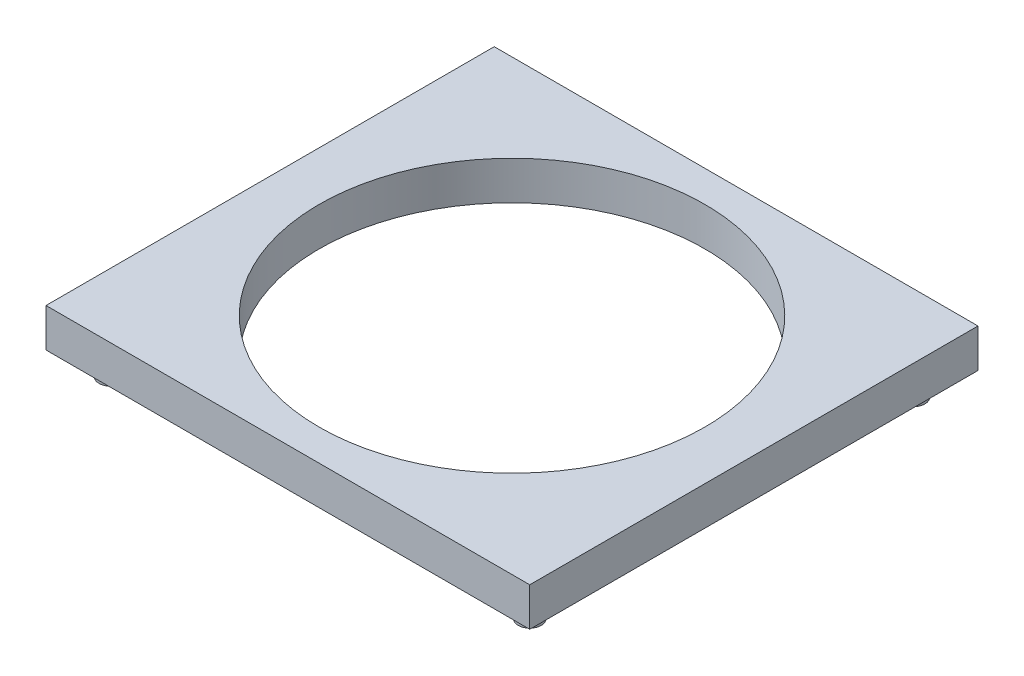
ISO-10303-21;
HEADER;
FILE_DESCRIPTION(('STEP AP214'),'2;1');
FILE_NAME('part.step','',(''),(''),'','','');
FILE_SCHEMA(('AUTOMOTIVE_DESIGN { 1 0 10303 214 1 1 1 1 }'));
ENDSEC;
DATA;
#1=APPLICATION_CONTEXT('core data for automotive mechanical design processes');
#2=APPLICATION_PROTOCOL_DEFINITION('international standard','automotive_design',2000,#1);
#3=PRODUCT_CONTEXT('',#1,'mechanical');
#4=PRODUCT('Part','Part','',(#3));
#5=PRODUCT_RELATED_PRODUCT_CATEGORY('part','',(#4));
#6=PRODUCT_DEFINITION_FORMATION('','',#4);
#7=PRODUCT_DEFINITION_CONTEXT('part definition',#1,'design');
#8=PRODUCT_DEFINITION('design','',#6,#7);
#9=PRODUCT_DEFINITION_SHAPE('','',#8);
#10=(LENGTH_UNIT() NAMED_UNIT(*) SI_UNIT(.MILLI.,.METRE.));
#11=(NAMED_UNIT(*) PLANE_ANGLE_UNIT() SI_UNIT($,.RADIAN.));
#12=(NAMED_UNIT(*) SI_UNIT($,.STERADIAN.) SOLID_ANGLE_UNIT());
#13=UNCERTAINTY_MEASURE_WITH_UNIT(LENGTH_MEASURE(1.E-05),#10,'distance_accuracy_value','');
#14=(GEOMETRIC_REPRESENTATION_CONTEXT(3) GLOBAL_UNCERTAINTY_ASSIGNED_CONTEXT((#13)) GLOBAL_UNIT_ASSIGNED_CONTEXT((#10,
#11,#12)) REPRESENTATION_CONTEXT('',''));
#15=CARTESIAN_POINT('',(0.,0.,0.));
#16=DIRECTION('',(0.,0.,1.));
#17=DIRECTION('',(1.,0.,0.));
#18=AXIS2_PLACEMENT_3D('',#15,#16,#17);
#19=CARTESIAN_POINT('',(0.,5.,0.));
#20=DIRECTION('',(0.,-1.,0.));
#21=DIRECTION('',(0.,0.,-1.));
#22=AXIS2_PLACEMENT_3D('',#19,#20,#21);
#23=PLANE('',#22);
#24=DIRECTION('',(0.,0.,-1.));
#25=VECTOR('',#24,1.);
#26=CARTESIAN_POINT('',(31.35,5.,29.05));
#27=LINE('',#26,#25);
#28=CARTESIAN_POINT('',(31.35,5.,29.05));
#29=VERTEX_POINT('',#28);
#30=CARTESIAN_POINT('',(31.35,5.,-29.05));
#31=VERTEX_POINT('',#30);
#32=EDGE_CURVE('E94',#29,#31,#27,.T.);
#33=ORIENTED_EDGE('',*,*,#32,.T.);
#34=DIRECTION('',(-1.,0.,0.));
#35=VECTOR('',#34,1.);
#36=CARTESIAN_POINT('',(-31.35,5.,-29.05));
#37=LINE('',#36,#35);
#38=CARTESIAN_POINT('',(-31.35,5.,-29.05));
#39=VERTEX_POINT('',#38);
#40=EDGE_CURVE('E89',#31,#39,#37,.T.);
#41=ORIENTED_EDGE('',*,*,#40,.T.);
#42=DIRECTION('',(0.,0.,1.));
#43=VECTOR('',#42,1.);
#44=CARTESIAN_POINT('',(-31.35,5.,29.05));
#45=LINE('',#44,#43);
#46=CARTESIAN_POINT('',(-31.35,5.,29.05));
#47=VERTEX_POINT('',#46);
#48=EDGE_CURVE('E92',#39,#47,#45,.T.);
#49=ORIENTED_EDGE('',*,*,#48,.T.);
#50=DIRECTION('',(1.,0.,0.));
#51=VECTOR('',#50,1.);
#52=CARTESIAN_POINT('',(-31.35,5.,29.05));
#53=LINE('',#52,#51);
#54=EDGE_CURVE('E59',#47,#29,#53,.T.);
#55=ORIENTED_EDGE('',*,*,#54,.T.);
#56=EDGE_LOOP('',(#33,#41,#49,#55));
#57=FACE_BOUND('',#56,.T.);
#58=CARTESIAN_POINT('',(0.,5.,0.));
#59=DIRECTION('',(0.,1.,0.));
#60=DIRECTION('',(0.,0.,1.));
#61=AXIS2_PLACEMENT_3D('',#58,#59,#60);
#62=CIRCLE('',#61,25.);
#63=CARTESIAN_POINT('',(0.,5.,25.));
#64=VERTEX_POINT('',#63);
#65=EDGE_CURVE('E109',#64,#64,#62,.T.);
#66=ORIENTED_EDGE('',*,*,#65,.F.);
#67=EDGE_LOOP('',(#66));
#68=FACE_BOUND('',#67,.T.);
#69=ADVANCED_FACE('F42',(#57,#68),#23,.F.);
#70=CARTESIAN_POINT('',(0.,0.,0.));
#71=DIRECTION('',(0.,-1.,0.));
#72=DIRECTION('',(0.,0.,-1.));
#73=AXIS2_PLACEMENT_3D('',#70,#71,#72);
#74=PLANE('',#73);
#75=CARTESIAN_POINT('',(-27.1634079738271,0.,-24.8634079738271));
#76=DIRECTION('',(0.,-1.,0.));
#77=DIRECTION('',(0.,0.,1.));
#78=AXIS2_PLACEMENT_3D('',#75,#76,#77);
#79=CIRCLE('',#78,1.5);
#80=CARTESIAN_POINT('',(-27.1634079738271,0.,-23.3634079738271));
#81=VERTEX_POINT('',#80);
#82=EDGE_CURVE('E142',#81,#81,#79,.T.);
#83=ORIENTED_EDGE('',*,*,#82,.F.);
#84=EDGE_LOOP('',(#83));
#85=FACE_BOUND('',#84,.T.);
#86=CARTESIAN_POINT('',(27.1634079738271,0.,-24.8634079738271));
#87=DIRECTION('',(0.,-1.,0.));
#88=DIRECTION('',(0.,0.,-1.));
#89=AXIS2_PLACEMENT_3D('',#86,#87,#88);
#90=CIRCLE('',#89,1.5);
#91=CARTESIAN_POINT('',(27.1634079738271,0.,-26.3634079738271));
#92=VERTEX_POINT('',#91);
#93=EDGE_CURVE('E136',#92,#92,#90,.T.);
#94=ORIENTED_EDGE('',*,*,#93,.F.);
#95=EDGE_LOOP('',(#94));
#96=FACE_BOUND('',#95,.T.);
#97=CARTESIAN_POINT('',(27.1634079738271,0.,24.8634079738271));
#98=DIRECTION('',(0.,-1.,0.));
#99=DIRECTION('',(0.,0.,1.));
#100=AXIS2_PLACEMENT_3D('',#97,#98,#99);
#101=CIRCLE('',#100,1.5);
#102=CARTESIAN_POINT('',(27.1634079738271,0.,26.3634079738271));
#103=VERTEX_POINT('',#102);
#104=EDGE_CURVE('E130',#103,#103,#101,.T.);
#105=ORIENTED_EDGE('',*,*,#104,.F.);
#106=EDGE_LOOP('',(#105));
#107=FACE_BOUND('',#106,.T.);
#108=CARTESIAN_POINT('',(-27.1634079738271,0.,24.8634079738271));
#109=DIRECTION('',(0.,-1.,0.));
#110=DIRECTION('',(0.,0.,-1.));
#111=AXIS2_PLACEMENT_3D('',#108,#109,#110);
#112=CIRCLE('',#111,1.5);
#113=CARTESIAN_POINT('',(-27.1634079738271,0.,23.3634079738271));
#114=VERTEX_POINT('',#113);
#115=EDGE_CURVE('E127',#114,#114,#112,.T.);
#116=ORIENTED_EDGE('',*,*,#115,.F.);
#117=EDGE_LOOP('',(#116));
#118=FACE_BOUND('',#117,.T.);
#119=DIRECTION('',(0.,0.,-1.));
#120=VECTOR('',#119,1.);
#121=CARTESIAN_POINT('',(31.35,0.,29.05));
#122=LINE('',#121,#120);
#123=CARTESIAN_POINT('',(31.35,0.,29.05));
#124=VERTEX_POINT('',#123);
#125=CARTESIAN_POINT('',(31.35,0.,-29.05));
#126=VERTEX_POINT('',#125);
#127=EDGE_CURVE('E106',#124,#126,#122,.T.);
#128=ORIENTED_EDGE('',*,*,#127,.F.);
#129=DIRECTION('',(1.,0.,0.));
#130=VECTOR('',#129,1.);
#131=CARTESIAN_POINT('',(-31.35,0.,29.05));
#132=LINE('',#131,#130);
#133=CARTESIAN_POINT('',(-31.35,0.,29.05));
#134=VERTEX_POINT('',#133);
#135=EDGE_CURVE('E82',#134,#124,#132,.T.);
#136=ORIENTED_EDGE('',*,*,#135,.F.);
#137=DIRECTION('',(0.,0.,1.));
#138=VECTOR('',#137,1.);
#139=CARTESIAN_POINT('',(-31.35,0.,29.05));
#140=LINE('',#139,#138);
#141=CARTESIAN_POINT('',(-31.35,0.,-29.05));
#142=VERTEX_POINT('',#141);
#143=EDGE_CURVE('E76',#142,#134,#140,.T.);
#144=ORIENTED_EDGE('',*,*,#143,.F.);
#145=DIRECTION('',(-1.,0.,0.));
#146=VECTOR('',#145,1.);
#147=CARTESIAN_POINT('',(-31.35,0.,-29.05));
#148=LINE('',#147,#146);
#149=EDGE_CURVE('E98',#126,#142,#148,.T.);
#150=ORIENTED_EDGE('',*,*,#149,.F.);
#151=EDGE_LOOP('',(#128,#136,#144,#150));
#152=FACE_BOUND('',#151,.T.);
#153=CARTESIAN_POINT('',(0.,0.,0.));
#154=DIRECTION('',(0.,1.,0.));
#155=DIRECTION('',(0.,0.,1.));
#156=AXIS2_PLACEMENT_3D('',#153,#154,#155);
#157=CIRCLE('',#156,25.);
#158=CARTESIAN_POINT('',(0.,0.,25.));
#159=VERTEX_POINT('',#158);
#160=EDGE_CURVE('E121',#159,#159,#157,.T.);
#161=ORIENTED_EDGE('',*,*,#160,.T.);
#162=EDGE_LOOP('',(#161));
#163=FACE_BOUND('',#162,.T.);
#164=ADVANCED_FACE('F117',(#85,#96,#107,#118,#152,#163),#74,.T.);
#165=CARTESIAN_POINT('',(31.35,5.,29.05));
#166=DIRECTION('',(-1.,0.,0.));
#167=DIRECTION('',(0.,0.,1.));
#168=AXIS2_PLACEMENT_3D('',#165,#166,#167);
#169=PLANE('',#168);
#170=ORIENTED_EDGE('',*,*,#127,.T.);
#171=DIRECTION('',(0.,-1.,0.));
#172=VECTOR('',#171,1.);
#173=CARTESIAN_POINT('',(31.35,5.,-29.05));
#174=LINE('',#173,#172);
#175=EDGE_CURVE('E11',#31,#126,#174,.T.);
#176=ORIENTED_EDGE('',*,*,#175,.F.);
#177=ORIENTED_EDGE('',*,*,#32,.F.);
#178=DIRECTION('',(0.,-1.,0.));
#179=VECTOR('',#178,1.);
#180=CARTESIAN_POINT('',(31.35,5.,29.05));
#181=LINE('',#180,#179);
#182=EDGE_CURVE('E102',#29,#124,#181,.T.);
#183=ORIENTED_EDGE('',*,*,#182,.T.);
#184=EDGE_LOOP('',(#170,#176,#177,#183));
#185=FACE_BOUND('',#184,.T.);
#186=ADVANCED_FACE('F44',(#185),#169,.F.);
#187=CARTESIAN_POINT('',(-31.35,5.,-29.05));
#188=DIRECTION('',(0.,0.,1.));
#189=DIRECTION('',(1.,0.,0.));
#190=AXIS2_PLACEMENT_3D('',#187,#188,#189);
#191=PLANE('',#190);
#192=ORIENTED_EDGE('',*,*,#149,.T.);
#193=DIRECTION('',(0.,-1.,0.));
#194=VECTOR('',#193,1.);
#195=CARTESIAN_POINT('',(-31.35,5.,-29.05));
#196=LINE('',#195,#194);
#197=EDGE_CURVE('E51',#39,#142,#196,.T.);
#198=ORIENTED_EDGE('',*,*,#197,.F.);
#199=ORIENTED_EDGE('',*,*,#40,.F.);
#200=ORIENTED_EDGE('',*,*,#175,.T.);
#201=EDGE_LOOP('',(#192,#198,#199,#200));
#202=FACE_BOUND('',#201,.T.);
#203=ADVANCED_FACE('F97',(#202),#191,.F.);
#204=CARTESIAN_POINT('',(-31.35,5.,29.05));
#205=DIRECTION('',(1.,0.,0.));
#206=DIRECTION('',(0.,0.,-1.));
#207=AXIS2_PLACEMENT_3D('',#204,#205,#206);
#208=PLANE('',#207);
#209=ORIENTED_EDGE('',*,*,#143,.T.);
#210=DIRECTION('',(0.,-1.,0.));
#211=VECTOR('',#210,1.);
#212=CARTESIAN_POINT('',(-31.35,5.,29.05));
#213=LINE('',#212,#211);
#214=EDGE_CURVE('E99',#47,#134,#213,.T.);
#215=ORIENTED_EDGE('',*,*,#214,.F.);
#216=ORIENTED_EDGE('',*,*,#48,.F.);
#217=ORIENTED_EDGE('',*,*,#197,.T.);
#218=EDGE_LOOP('',(#209,#215,#216,#217));
#219=FACE_BOUND('',#218,.T.);
#220=ADVANCED_FACE('F100',(#219),#208,.F.);
#221=CARTESIAN_POINT('',(-31.35,5.,29.05));
#222=DIRECTION('',(0.,0.,-1.));
#223=DIRECTION('',(-1.,0.,0.));
#224=AXIS2_PLACEMENT_3D('',#221,#222,#223);
#225=PLANE('',#224);
#226=ORIENTED_EDGE('',*,*,#135,.T.);
#227=ORIENTED_EDGE('',*,*,#182,.F.);
#228=ORIENTED_EDGE('',*,*,#54,.F.);
#229=ORIENTED_EDGE('',*,*,#214,.T.);
#230=EDGE_LOOP('',(#226,#227,#228,#229));
#231=FACE_BOUND('',#230,.T.);
#232=ADVANCED_FACE('F114',(#231),#225,.F.);
#233=CARTESIAN_POINT('',(0.,5.,0.));
#234=DIRECTION('',(0.,-1.,0.));
#235=DIRECTION('',(0.,0.,-1.));
#236=AXIS2_PLACEMENT_3D('',#233,#234,#235);
#237=CYLINDRICAL_SURFACE('',#236,25.);
#238=ORIENTED_EDGE('',*,*,#65,.T.);
#239=EDGE_LOOP('',(#238));
#240=FACE_BOUND('',#239,.T.);
#241=ORIENTED_EDGE('',*,*,#160,.F.);
#242=EDGE_LOOP('',(#241));
#243=FACE_BOUND('',#242,.T.);
#244=ADVANCED_FACE('F165',(#240,#243),#237,.F.);
#245=CARTESIAN_POINT('',(-27.1634079738271,-3.,24.8634079738271));
#246=DIRECTION('',(0.,1.,0.));
#247=DIRECTION('',(0.,0.,1.));
#248=AXIS2_PLACEMENT_3D('',#245,#246,#247);
#249=CYLINDRICAL_SURFACE('',#248,1.5);
#250=CARTESIAN_POINT('',(-27.1634079738271,-3.,24.8634079738271));
#251=DIRECTION('',(0.,-1.,0.));
#252=DIRECTION('',(0.,0.,-1.));
#253=AXIS2_PLACEMENT_3D('',#250,#251,#252);
#254=CIRCLE('',#253,1.5);
#255=CARTESIAN_POINT('',(-27.1634079738271,-3.,23.3634079738271));
#256=VERTEX_POINT('',#255);
#257=EDGE_CURVE('E124',#256,#256,#254,.T.);
#258=ORIENTED_EDGE('',*,*,#257,.F.);
#259=EDGE_LOOP('',(#258));
#260=FACE_BOUND('',#259,.T.);
#261=ORIENTED_EDGE('',*,*,#115,.T.);
#262=EDGE_LOOP('',(#261));
#263=FACE_BOUND('',#262,.T.);
#264=ADVANCED_FACE('F162',(#260,#263),#249,.T.);
#265=CARTESIAN_POINT('',(-27.1634079738271,-3.,24.8634079738271));
#266=DIRECTION('',(0.,-1.,0.));
#267=DIRECTION('',(0.,0.,-1.));
#268=AXIS2_PLACEMENT_3D('',#265,#266,#267);
#269=PLANE('',#268);
#270=ORIENTED_EDGE('',*,*,#257,.T.);
#271=EDGE_LOOP('',(#270));
#272=FACE_BOUND('',#271,.T.);
#273=ADVANCED_FACE('F164',(#272),#269,.T.);
#274=CARTESIAN_POINT('',(27.1634079738271,-3.,24.8634079738271));
#275=DIRECTION('',(0.,1.,0.));
#276=DIRECTION('',(0.,0.,1.));
#277=AXIS2_PLACEMENT_3D('',#274,#275,#276);
#278=CYLINDRICAL_SURFACE('',#277,1.5);
#279=CARTESIAN_POINT('',(27.1634079738271,-3.,24.8634079738271));
#280=DIRECTION('',(0.,-1.,0.));
#281=DIRECTION('',(0.,0.,1.));
#282=AXIS2_PLACEMENT_3D('',#279,#280,#281);
#283=CIRCLE('',#282,1.5);
#284=CARTESIAN_POINT('',(27.1634079738271,-3.,26.3634079738271));
#285=VERTEX_POINT('',#284);
#286=EDGE_CURVE('E133',#285,#285,#283,.T.);
#287=ORIENTED_EDGE('',*,*,#286,.F.);
#288=EDGE_LOOP('',(#287));
#289=FACE_BOUND('',#288,.T.);
#290=ORIENTED_EDGE('',*,*,#104,.T.);
#291=EDGE_LOOP('',(#290));
#292=FACE_BOUND('',#291,.T.);
#293=ADVANCED_FACE('F171',(#289,#292),#278,.T.);
#294=CARTESIAN_POINT('',(27.1634079738271,-3.,24.8634079738271));
#295=DIRECTION('',(0.,1.,0.));
#296=DIRECTION('',(0.,0.,1.));
#297=AXIS2_PLACEMENT_3D('',#294,#295,#296);
#298=PLANE('',#297);
#299=ORIENTED_EDGE('',*,*,#286,.T.);
#300=EDGE_LOOP('',(#299));
#301=FACE_BOUND('',#300,.T.);
#302=ADVANCED_FACE('F238',(#301),#298,.F.);
#303=CARTESIAN_POINT('',(27.1634079738271,-3.,-24.8634079738271));
#304=DIRECTION('',(0.,1.,0.));
#305=DIRECTION('',(0.,0.,1.));
#306=AXIS2_PLACEMENT_3D('',#303,#304,#305);
#307=CYLINDRICAL_SURFACE('',#306,1.5);
#308=CARTESIAN_POINT('',(27.1634079738271,-3.,-24.8634079738271));
#309=DIRECTION('',(0.,-1.,0.));
#310=DIRECTION('',(0.,0.,-1.));
#311=AXIS2_PLACEMENT_3D('',#308,#309,#310);
#312=CIRCLE('',#311,1.5);
#313=CARTESIAN_POINT('',(27.1634079738271,-3.,-26.3634079738271));
#314=VERTEX_POINT('',#313);
#315=EDGE_CURVE('E139',#314,#314,#312,.T.);
#316=ORIENTED_EDGE('',*,*,#315,.F.);
#317=EDGE_LOOP('',(#316));
#318=FACE_BOUND('',#317,.T.);
#319=ORIENTED_EDGE('',*,*,#93,.T.);
#320=EDGE_LOOP('',(#319));
#321=FACE_BOUND('',#320,.T.);
#322=ADVANCED_FACE('F248',(#318,#321),#307,.T.);
#323=CARTESIAN_POINT('',(27.1634079738271,-3.,-24.8634079738271));
#324=DIRECTION('',(0.,-1.,0.));
#325=DIRECTION('',(0.,0.,-1.));
#326=AXIS2_PLACEMENT_3D('',#323,#324,#325);
#327=PLANE('',#326);
#328=ORIENTED_EDGE('',*,*,#315,.T.);
#329=EDGE_LOOP('',(#328));
#330=FACE_BOUND('',#329,.T.);
#331=ADVANCED_FACE('F258',(#330),#327,.T.);
#332=CARTESIAN_POINT('',(-27.1634079738271,-3.,-24.8634079738271));
#333=DIRECTION('',(0.,1.,0.));
#334=DIRECTION('',(0.,0.,1.));
#335=AXIS2_PLACEMENT_3D('',#332,#333,#334);
#336=CYLINDRICAL_SURFACE('',#335,1.5);
#337=CARTESIAN_POINT('',(-27.1634079738271,-3.,-24.8634079738271));
#338=DIRECTION('',(0.,-1.,0.));
#339=DIRECTION('',(0.,0.,1.));
#340=AXIS2_PLACEMENT_3D('',#337,#338,#339);
#341=CIRCLE('',#340,1.5);
#342=CARTESIAN_POINT('',(-27.1634079738271,-3.,-23.3634079738271));
#343=VERTEX_POINT('',#342);
#344=EDGE_CURVE('E145',#343,#343,#341,.T.);
#345=ORIENTED_EDGE('',*,*,#344,.F.);
#346=EDGE_LOOP('',(#345));
#347=FACE_BOUND('',#346,.T.);
#348=ORIENTED_EDGE('',*,*,#82,.T.);
#349=EDGE_LOOP('',(#348));
#350=FACE_BOUND('',#349,.T.);
#351=ADVANCED_FACE('F151',(#347,#350),#336,.T.);
#352=CARTESIAN_POINT('',(-27.1634079738271,-3.,-24.8634079738271));
#353=DIRECTION('',(0.,1.,0.));
#354=DIRECTION('',(0.,0.,1.));
#355=AXIS2_PLACEMENT_3D('',#352,#353,#354);
#356=PLANE('',#355);
#357=ORIENTED_EDGE('',*,*,#344,.T.);
#358=EDGE_LOOP('',(#357));
#359=FACE_BOUND('',#358,.T.);
#360=ADVANCED_FACE('F277',(#359),#356,.F.);
#361=CLOSED_SHELL('',(#69,#164,#186,#203,#220,#232,#244,#264,#273,#293,#302,#322,#331,#351,#360));
#362=MANIFOLD_SOLID_BREP('B2',#361);
#363=ADVANCED_BREP_SHAPE_REPRESENTATION('',(#18,#362),#14);
#364=SHAPE_DEFINITION_REPRESENTATION(#9,#363);
ENDSEC;
END-ISO-10303-21;
